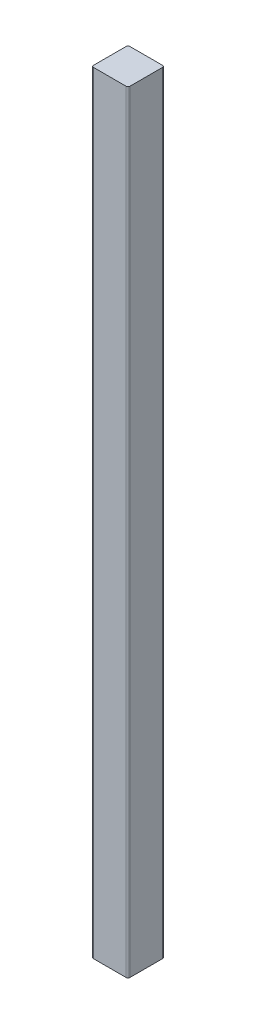
ISO-10303-21;
HEADER;
FILE_DESCRIPTION(('STEP AP214'),'2;1');
FILE_NAME('part.step','',(''),(''),'','','');
FILE_SCHEMA(('AUTOMOTIVE_DESIGN { 1 0 10303 214 1 1 1 1 }'));
ENDSEC;
DATA;
#1=APPLICATION_CONTEXT('core data for automotive mechanical design processes');
#2=APPLICATION_PROTOCOL_DEFINITION('international standard','automotive_design',2000,#1);
#3=PRODUCT_CONTEXT('',#1,'mechanical');
#4=PRODUCT('Part','Part','',(#3));
#5=PRODUCT_RELATED_PRODUCT_CATEGORY('part','',(#4));
#6=PRODUCT_DEFINITION_FORMATION('','',#4);
#7=PRODUCT_DEFINITION_CONTEXT('part definition',#1,'design');
#8=PRODUCT_DEFINITION('design','',#6,#7);
#9=PRODUCT_DEFINITION_SHAPE('','',#8);
#10=(LENGTH_UNIT() NAMED_UNIT(*) SI_UNIT(.MILLI.,.METRE.));
#11=(NAMED_UNIT(*) PLANE_ANGLE_UNIT() SI_UNIT($,.RADIAN.));
#12=(NAMED_UNIT(*) SI_UNIT($,.STERADIAN.) SOLID_ANGLE_UNIT());
#13=UNCERTAINTY_MEASURE_WITH_UNIT(LENGTH_MEASURE(1.E-05),#10,'distance_accuracy_value','');
#14=(GEOMETRIC_REPRESENTATION_CONTEXT(3) GLOBAL_UNCERTAINTY_ASSIGNED_CONTEXT((#13)) GLOBAL_UNIT_ASSIGNED_CONTEXT((#10,
#11,#12)) REPRESENTATION_CONTEXT('',''));
#15=CARTESIAN_POINT('',(0.,0.,0.));
#16=DIRECTION('',(0.,0.,1.));
#17=DIRECTION('',(1.,0.,0.));
#18=AXIS2_PLACEMENT_3D('',#15,#16,#17);
#19=CARTESIAN_POINT('',(-18.,850.,18.));
#20=DIRECTION('',(0.,-1.,0.));
#21=DIRECTION('',(0.,0.,-1.));
#22=AXIS2_PLACEMENT_3D('',#19,#20,#21);
#23=CYLINDRICAL_SURFACE('',#22,2.);
#24=CARTESIAN_POINT('',(-18.,0.,18.));
#25=DIRECTION('',(0.,1.,0.));
#26=DIRECTION('',(0.,0.,1.));
#27=AXIS2_PLACEMENT_3D('',#24,#25,#26);
#28=CIRCLE('',#27,2.);
#29=CARTESIAN_POINT('',(-20.,0.,18.));
#30=VERTEX_POINT('',#29);
#31=CARTESIAN_POINT('',(-18.,0.,20.));
#32=VERTEX_POINT('',#31);
#33=EDGE_CURVE('E140',#30,#32,#28,.T.);
#34=ORIENTED_EDGE('',*,*,#33,.T.);
#35=DIRECTION('',(0.,-1.,0.));
#36=VECTOR('',#35,1.);
#37=CARTESIAN_POINT('',(-18.,850.,20.));
#38=LINE('',#37,#36);
#39=CARTESIAN_POINT('',(-18.,850.,20.));
#40=VERTEX_POINT('',#39);
#41=EDGE_CURVE('E11',#40,#32,#38,.T.);
#42=ORIENTED_EDGE('',*,*,#41,.F.);
#43=CARTESIAN_POINT('',(-18.,850.,18.));
#44=DIRECTION('',(0.,1.,0.));
#45=DIRECTION('',(0.,0.,1.));
#46=AXIS2_PLACEMENT_3D('',#43,#44,#45);
#47=CIRCLE('',#46,2.);
#48=CARTESIAN_POINT('',(-20.,850.,18.));
#49=VERTEX_POINT('',#48);
#50=EDGE_CURVE('E162',#49,#40,#47,.T.);
#51=ORIENTED_EDGE('',*,*,#50,.F.);
#52=DIRECTION('',(0.,-1.,0.));
#53=VECTOR('',#52,1.);
#54=CARTESIAN_POINT('',(-20.,850.,18.));
#55=LINE('',#54,#53);
#56=EDGE_CURVE('E136',#49,#30,#55,.T.);
#57=ORIENTED_EDGE('',*,*,#56,.T.);
#58=EDGE_LOOP('',(#34,#42,#51,#57));
#59=FACE_BOUND('',#58,.T.);
#60=ADVANCED_FACE('F39',(#59),#23,.T.);
#61=CARTESIAN_POINT('',(-18.,850.,20.));
#62=DIRECTION('',(0.,0.,-1.));
#63=DIRECTION('',(-1.,0.,0.));
#64=AXIS2_PLACEMENT_3D('',#61,#62,#63);
#65=PLANE('',#64);
#66=DIRECTION('',(1.,0.,0.));
#67=VECTOR('',#66,1.);
#68=CARTESIAN_POINT('',(-18.,0.,20.));
#69=LINE('',#68,#67);
#70=CARTESIAN_POINT('',(18.,0.,20.));
#71=VERTEX_POINT('',#70);
#72=EDGE_CURVE('E144',#32,#71,#69,.T.);
#73=ORIENTED_EDGE('',*,*,#72,.T.);
#74=DIRECTION('',(0.,-1.,0.));
#75=VECTOR('',#74,1.);
#76=CARTESIAN_POINT('',(18.,850.,20.));
#77=LINE('',#76,#75);
#78=CARTESIAN_POINT('',(18.,850.,20.));
#79=VERTEX_POINT('',#78);
#80=EDGE_CURVE('E48',#79,#71,#77,.T.);
#81=ORIENTED_EDGE('',*,*,#80,.F.);
#82=DIRECTION('',(1.,0.,0.));
#83=VECTOR('',#82,1.);
#84=CARTESIAN_POINT('',(-18.,850.,20.));
#85=LINE('',#84,#83);
#86=EDGE_CURVE('E99',#40,#79,#85,.T.);
#87=ORIENTED_EDGE('',*,*,#86,.F.);
#88=ORIENTED_EDGE('',*,*,#41,.T.);
#89=EDGE_LOOP('',(#73,#81,#87,#88));
#90=FACE_BOUND('',#89,.T.);
#91=ADVANCED_FACE('F208',(#90),#65,.F.);
#92=CARTESIAN_POINT('',(18.,850.,18.));
#93=DIRECTION('',(0.,-1.,0.));
#94=DIRECTION('',(0.,0.,-1.));
#95=AXIS2_PLACEMENT_3D('',#92,#93,#94);
#96=CYLINDRICAL_SURFACE('',#95,2.);
#97=CARTESIAN_POINT('',(18.,0.,18.));
#98=DIRECTION('',(0.,1.,0.));
#99=DIRECTION('',(0.,0.,1.));
#100=AXIS2_PLACEMENT_3D('',#97,#98,#99);
#101=CIRCLE('',#100,2.);
#102=CARTESIAN_POINT('',(20.,0.,18.));
#103=VERTEX_POINT('',#102);
#104=EDGE_CURVE('E147',#71,#103,#101,.T.);
#105=ORIENTED_EDGE('',*,*,#104,.T.);
#106=DIRECTION('',(0.,-1.,0.));
#107=VECTOR('',#106,1.);
#108=CARTESIAN_POINT('',(20.,850.,18.));
#109=LINE('',#108,#107);
#110=CARTESIAN_POINT('',(20.,850.,18.));
#111=VERTEX_POINT('',#110);
#112=EDGE_CURVE('E173',#111,#103,#109,.T.);
#113=ORIENTED_EDGE('',*,*,#112,.F.);
#114=CARTESIAN_POINT('',(18.,850.,18.));
#115=DIRECTION('',(0.,1.,0.));
#116=DIRECTION('',(0.,0.,1.));
#117=AXIS2_PLACEMENT_3D('',#114,#115,#116);
#118=CIRCLE('',#117,2.);
#119=EDGE_CURVE('E183',#79,#111,#118,.T.);
#120=ORIENTED_EDGE('',*,*,#119,.F.);
#121=ORIENTED_EDGE('',*,*,#80,.T.);
#122=EDGE_LOOP('',(#105,#113,#120,#121));
#123=FACE_BOUND('',#122,.T.);
#124=ADVANCED_FACE('F181',(#123),#96,.T.);
#125=CARTESIAN_POINT('',(20.,850.,-18.));
#126=DIRECTION('',(-1.,0.,0.));
#127=DIRECTION('',(0.,0.,1.));
#128=AXIS2_PLACEMENT_3D('',#125,#126,#127);
#129=PLANE('',#128);
#130=DIRECTION('',(0.,0.,-1.));
#131=VECTOR('',#130,1.);
#132=CARTESIAN_POINT('',(20.,0.,-18.));
#133=LINE('',#132,#131);
#134=CARTESIAN_POINT('',(20.,0.,-18.));
#135=VERTEX_POINT('',#134);
#136=EDGE_CURVE('E150',#103,#135,#133,.T.);
#137=ORIENTED_EDGE('',*,*,#136,.T.);
#138=DIRECTION('',(0.,-1.,0.));
#139=VECTOR('',#138,1.);
#140=CARTESIAN_POINT('',(20.,850.,-18.));
#141=LINE('',#140,#139);
#142=CARTESIAN_POINT('',(20.,850.,-18.));
#143=VERTEX_POINT('',#142);
#144=EDGE_CURVE('E169',#143,#135,#141,.T.);
#145=ORIENTED_EDGE('',*,*,#144,.F.);
#146=DIRECTION('',(0.,0.,-1.));
#147=VECTOR('',#146,1.);
#148=CARTESIAN_POINT('',(20.,850.,-18.));
#149=LINE('',#148,#147);
#150=EDGE_CURVE('E196',#111,#143,#149,.T.);
#151=ORIENTED_EDGE('',*,*,#150,.F.);
#152=ORIENTED_EDGE('',*,*,#112,.T.);
#153=EDGE_LOOP('',(#137,#145,#151,#152));
#154=FACE_BOUND('',#153,.T.);
#155=ADVANCED_FACE('F191',(#154),#129,.F.);
#156=CARTESIAN_POINT('',(18.,850.,-18.));
#157=DIRECTION('',(0.,-1.,0.));
#158=DIRECTION('',(0.,0.,-1.));
#159=AXIS2_PLACEMENT_3D('',#156,#157,#158);
#160=CYLINDRICAL_SURFACE('',#159,2.);
#161=CARTESIAN_POINT('',(18.,0.,-18.));
#162=DIRECTION('',(0.,1.,0.));
#163=DIRECTION('',(0.,0.,-1.));
#164=AXIS2_PLACEMENT_3D('',#161,#162,#163);
#165=CIRCLE('',#164,2.);
#166=CARTESIAN_POINT('',(18.,0.,-20.));
#167=VERTEX_POINT('',#166);
#168=EDGE_CURVE('E153',#135,#167,#165,.T.);
#169=ORIENTED_EDGE('',*,*,#168,.T.);
#170=DIRECTION('',(0.,-1.,0.));
#171=VECTOR('',#170,1.);
#172=CARTESIAN_POINT('',(18.,850.,-20.));
#173=LINE('',#172,#171);
#174=CARTESIAN_POINT('',(18.,850.,-20.));
#175=VERTEX_POINT('',#174);
#176=EDGE_CURVE('E129',#175,#167,#173,.T.);
#177=ORIENTED_EDGE('',*,*,#176,.F.);
#178=CARTESIAN_POINT('',(18.,850.,-18.));
#179=DIRECTION('',(0.,1.,0.));
#180=DIRECTION('',(0.,0.,-1.));
#181=AXIS2_PLACEMENT_3D('',#178,#179,#180);
#182=CIRCLE('',#181,2.);
#183=EDGE_CURVE('E118',#143,#175,#182,.T.);
#184=ORIENTED_EDGE('',*,*,#183,.F.);
#185=ORIENTED_EDGE('',*,*,#144,.T.);
#186=EDGE_LOOP('',(#169,#177,#184,#185));
#187=FACE_BOUND('',#186,.T.);
#188=ADVANCED_FACE('F194',(#187),#160,.T.);
#189=CARTESIAN_POINT('',(-18.,850.,-20.));
#190=DIRECTION('',(0.,0.,1.));
#191=DIRECTION('',(1.,0.,0.));
#192=AXIS2_PLACEMENT_3D('',#189,#190,#191);
#193=PLANE('',#192);
#194=DIRECTION('',(-1.,0.,0.));
#195=VECTOR('',#194,1.);
#196=CARTESIAN_POINT('',(-18.,0.,-20.));
#197=LINE('',#196,#195);
#198=CARTESIAN_POINT('',(-18.,0.,-20.));
#199=VERTEX_POINT('',#198);
#200=EDGE_CURVE('E127',#167,#199,#197,.T.);
#201=ORIENTED_EDGE('',*,*,#200,.T.);
#202=DIRECTION('',(0.,-1.,0.));
#203=VECTOR('',#202,1.);
#204=CARTESIAN_POINT('',(-18.,850.,-20.));
#205=LINE('',#204,#203);
#206=CARTESIAN_POINT('',(-18.,850.,-20.));
#207=VERTEX_POINT('',#206);
#208=EDGE_CURVE('E124',#207,#199,#205,.T.);
#209=ORIENTED_EDGE('',*,*,#208,.F.);
#210=DIRECTION('',(-1.,0.,0.));
#211=VECTOR('',#210,1.);
#212=CARTESIAN_POINT('',(-18.,850.,-20.));
#213=LINE('',#212,#211);
#214=EDGE_CURVE('E112',#175,#207,#213,.T.);
#215=ORIENTED_EDGE('',*,*,#214,.F.);
#216=ORIENTED_EDGE('',*,*,#176,.T.);
#217=EDGE_LOOP('',(#201,#209,#215,#216));
#218=FACE_BOUND('',#217,.T.);
#219=ADVANCED_FACE('F125',(#218),#193,.F.);
#220=CARTESIAN_POINT('',(-18.,850.,-18.));
#221=DIRECTION('',(0.,-1.,0.));
#222=DIRECTION('',(0.,0.,-1.));
#223=AXIS2_PLACEMENT_3D('',#220,#221,#222);
#224=CYLINDRICAL_SURFACE('',#223,2.);
#225=CARTESIAN_POINT('',(-18.,0.,-18.));
#226=DIRECTION('',(0.,1.,0.));
#227=DIRECTION('',(0.,0.,1.));
#228=AXIS2_PLACEMENT_3D('',#225,#226,#227);
#229=CIRCLE('',#228,2.);
#230=CARTESIAN_POINT('',(-20.,0.,-18.));
#231=VERTEX_POINT('',#230);
#232=EDGE_CURVE('E85',#199,#231,#229,.T.);
#233=ORIENTED_EDGE('',*,*,#232,.T.);
#234=DIRECTION('',(0.,-1.,0.));
#235=VECTOR('',#234,1.);
#236=CARTESIAN_POINT('',(-20.,850.,-18.));
#237=LINE('',#236,#235);
#238=CARTESIAN_POINT('',(-20.,850.,-18.));
#239=VERTEX_POINT('',#238);
#240=EDGE_CURVE('E130',#239,#231,#237,.T.);
#241=ORIENTED_EDGE('',*,*,#240,.F.);
#242=CARTESIAN_POINT('',(-18.,850.,-18.));
#243=DIRECTION('',(0.,1.,0.));
#244=DIRECTION('',(0.,0.,1.));
#245=AXIS2_PLACEMENT_3D('',#242,#243,#244);
#246=CIRCLE('',#245,2.);
#247=EDGE_CURVE('E116',#207,#239,#246,.T.);
#248=ORIENTED_EDGE('',*,*,#247,.F.);
#249=ORIENTED_EDGE('',*,*,#208,.T.);
#250=EDGE_LOOP('',(#233,#241,#248,#249));
#251=FACE_BOUND('',#250,.T.);
#252=ADVANCED_FACE('F132',(#251),#224,.T.);
#253=CARTESIAN_POINT('',(-20.,850.,-18.));
#254=DIRECTION('',(1.,0.,0.));
#255=DIRECTION('',(0.,0.,-1.));
#256=AXIS2_PLACEMENT_3D('',#253,#254,#255);
#257=PLANE('',#256);
#258=DIRECTION('',(0.,0.,1.));
#259=VECTOR('',#258,1.);
#260=CARTESIAN_POINT('',(-20.,0.,-18.));
#261=LINE('',#260,#259);
#262=EDGE_CURVE('E91',#231,#30,#261,.T.);
#263=ORIENTED_EDGE('',*,*,#262,.T.);
#264=ORIENTED_EDGE('',*,*,#56,.F.);
#265=DIRECTION('',(0.,0.,1.));
#266=VECTOR('',#265,1.);
#267=CARTESIAN_POINT('',(-20.,850.,-18.));
#268=LINE('',#267,#266);
#269=EDGE_CURVE('E56',#239,#49,#268,.T.);
#270=ORIENTED_EDGE('',*,*,#269,.F.);
#271=ORIENTED_EDGE('',*,*,#240,.T.);
#272=EDGE_LOOP('',(#263,#264,#270,#271));
#273=FACE_BOUND('',#272,.T.);
#274=ADVANCED_FACE('F224',(#273),#257,.F.);
#275=CARTESIAN_POINT('',(-18.,850.,18.));
#276=DIRECTION('',(0.,1.,0.));
#277=DIRECTION('',(0.,0.,1.));
#278=AXIS2_PLACEMENT_3D('',#275,#276,#277);
#279=PLANE('',#278);
#280=ORIENTED_EDGE('',*,*,#50,.T.);
#281=ORIENTED_EDGE('',*,*,#86,.T.);
#282=ORIENTED_EDGE('',*,*,#119,.T.);
#283=ORIENTED_EDGE('',*,*,#150,.T.);
#284=ORIENTED_EDGE('',*,*,#183,.T.);
#285=ORIENTED_EDGE('',*,*,#214,.T.);
#286=ORIENTED_EDGE('',*,*,#247,.T.);
#287=ORIENTED_EDGE('',*,*,#269,.T.);
#288=EDGE_LOOP('',(#280,#281,#282,#283,#284,#285,#286,#287));
#289=FACE_BOUND('',#288,.T.);
#290=ADVANCED_FACE('F114',(#289),#279,.T.);
#291=CARTESIAN_POINT('',(-18.,0.,18.));
#292=DIRECTION('',(0.,1.,0.));
#293=DIRECTION('',(0.,0.,1.));
#294=AXIS2_PLACEMENT_3D('',#291,#292,#293);
#295=PLANE('',#294);
#296=ORIENTED_EDGE('',*,*,#33,.F.);
#297=ORIENTED_EDGE('',*,*,#262,.F.);
#298=ORIENTED_EDGE('',*,*,#232,.F.);
#299=ORIENTED_EDGE('',*,*,#200,.F.);
#300=ORIENTED_EDGE('',*,*,#168,.F.);
#301=ORIENTED_EDGE('',*,*,#136,.F.);
#302=ORIENTED_EDGE('',*,*,#104,.F.);
#303=ORIENTED_EDGE('',*,*,#72,.F.);
#304=EDGE_LOOP('',(#296,#297,#298,#299,#300,#301,#302,#303));
#305=FACE_BOUND('',#304,.T.);
#306=ADVANCED_FACE('F187',(#305),#295,.F.);
#307=CLOSED_SHELL('',(#60,#91,#124,#155,#188,#219,#252,#274,#290,#306));
#308=MANIFOLD_SOLID_BREP('B2',#307);
#309=ADVANCED_BREP_SHAPE_REPRESENTATION('',(#18,#308),#14);
#310=SHAPE_DEFINITION_REPRESENTATION(#9,#309);
ENDSEC;
END-ISO-10303-21;
